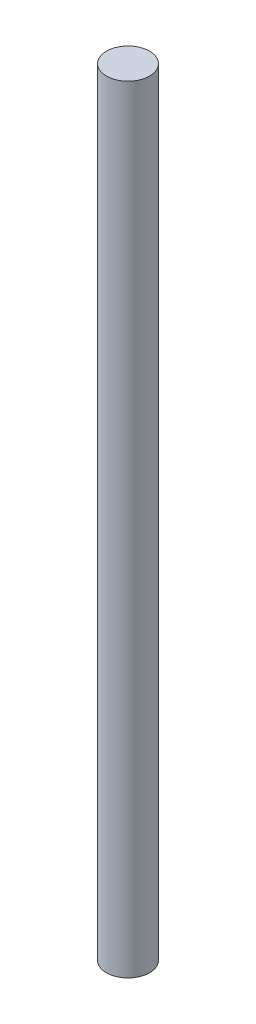
ISO-10303-21;
HEADER;
FILE_DESCRIPTION(('STEP AP214'),'2;1');
FILE_NAME('part.step','',(''),(''),'','','');
FILE_SCHEMA(('AUTOMOTIVE_DESIGN { 1 0 10303 214 1 1 1 1 }'));
ENDSEC;
DATA;
#1=APPLICATION_CONTEXT('core data for automotive mechanical design processes');
#2=APPLICATION_PROTOCOL_DEFINITION('international standard','automotive_design',2000,#1);
#3=PRODUCT_CONTEXT('',#1,'mechanical');
#4=PRODUCT('Part','Part','',(#3));
#5=PRODUCT_RELATED_PRODUCT_CATEGORY('part','',(#4));
#6=PRODUCT_DEFINITION_FORMATION('','',#4);
#7=PRODUCT_DEFINITION_CONTEXT('part definition',#1,'design');
#8=PRODUCT_DEFINITION('design','',#6,#7);
#9=PRODUCT_DEFINITION_SHAPE('','',#8);
#10=(LENGTH_UNIT() NAMED_UNIT(*) SI_UNIT(.MILLI.,.METRE.));
#11=(NAMED_UNIT(*) PLANE_ANGLE_UNIT() SI_UNIT($,.RADIAN.));
#12=(NAMED_UNIT(*) SI_UNIT($,.STERADIAN.) SOLID_ANGLE_UNIT());
#13=UNCERTAINTY_MEASURE_WITH_UNIT(LENGTH_MEASURE(1.E-05),#10,'distance_accuracy_value','');
#14=(GEOMETRIC_REPRESENTATION_CONTEXT(3) GLOBAL_UNCERTAINTY_ASSIGNED_CONTEXT((#13)) GLOBAL_UNIT_ASSIGNED_CONTEXT((#10,
#11,#12)) REPRESENTATION_CONTEXT('',''));
#15=CARTESIAN_POINT('',(0.,0.,0.));
#16=DIRECTION('',(0.,0.,1.));
#17=DIRECTION('',(1.,0.,0.));
#18=AXIS2_PLACEMENT_3D('',#15,#16,#17);
#19=CARTESIAN_POINT('',(0.,90.,0.));
#20=DIRECTION('',(0.,-1.,0.));
#21=DIRECTION('',(0.,0.,-1.));
#22=AXIS2_PLACEMENT_3D('',#19,#20,#21);
#23=CYLINDRICAL_SURFACE('',#22,2.5);
#24=CARTESIAN_POINT('',(0.,90.,0.));
#25=DIRECTION('',(0.,1.,0.));
#26=DIRECTION('',(0.,0.,1.));
#27=AXIS2_PLACEMENT_3D('',#24,#25,#26);
#28=CIRCLE('',#27,2.5);
#29=CARTESIAN_POINT('',(0.,90.,-2.5));
#30=VERTEX_POINT('',#29);
#31=EDGE_CURVE('E10',#30,#30,#28,.T.);
#32=CARTESIAN_POINT('',(0.,0.,0.));
#33=DIRECTION('',(0.,1.,0.));
#34=DIRECTION('',(0.,0.,1.));
#35=AXIS2_PLACEMENT_3D('',#32,#33,#34);
#36=CIRCLE('',#35,2.5);
#37=CARTESIAN_POINT('',(0.,0.,-2.5));
#38=VERTEX_POINT('',#37);
#39=EDGE_CURVE('E36',#38,#38,#36,.T.);
#40=CARTESIAN_POINT('',(0.,90.,-2.5));
#41=CARTESIAN_POINT('',(0.,89.0625,-2.5));
#42=CARTESIAN_POINT('',(0.,88.125,-2.5));
#43=CARTESIAN_POINT('',(0.,86.25,-2.5));
#44=CARTESIAN_POINT('',(0.,85.3125,-2.5));
#45=CARTESIAN_POINT('',(0.,83.4375,-2.5));
#46=CARTESIAN_POINT('',(0.,82.5,-2.5));
#47=CARTESIAN_POINT('',(0.,80.625,-2.5));
#48=CARTESIAN_POINT('',(0.,79.6875,-2.5));
#49=CARTESIAN_POINT('',(0.,77.8125,-2.5));
#50=CARTESIAN_POINT('',(0.,76.875,-2.5));
#51=CARTESIAN_POINT('',(0.,75.,-2.5));
#52=CARTESIAN_POINT('',(0.,74.0625,-2.5));
#53=CARTESIAN_POINT('',(0.,72.1875,-2.5));
#54=CARTESIAN_POINT('',(0.,71.25,-2.5));
#55=CARTESIAN_POINT('',(0.,69.375,-2.5));
#56=CARTESIAN_POINT('',(0.,68.4375,-2.5));
#57=CARTESIAN_POINT('',(0.,66.5625,-2.5));
#58=CARTESIAN_POINT('',(0.,65.625,-2.5));
#59=CARTESIAN_POINT('',(0.,63.75,-2.5));
#60=CARTESIAN_POINT('',(0.,62.8125,-2.5));
#61=CARTESIAN_POINT('',(0.,60.9375,-2.5));
#62=CARTESIAN_POINT('',(0.,60.,-2.5));
#63=CARTESIAN_POINT('',(0.,58.125,-2.5));
#64=CARTESIAN_POINT('',(0.,57.1875,-2.5));
#65=CARTESIAN_POINT('',(0.,55.3125,-2.5));
#66=CARTESIAN_POINT('',(0.,54.375,-2.5));
#67=CARTESIAN_POINT('',(0.,52.5,-2.5));
#68=CARTESIAN_POINT('',(0.,51.5625,-2.5));
#69=CARTESIAN_POINT('',(0.,49.6875,-2.5));
#70=CARTESIAN_POINT('',(0.,48.75,-2.5));
#71=CARTESIAN_POINT('',(0.,46.875,-2.5));
#72=CARTESIAN_POINT('',(0.,45.9375,-2.5));
#73=CARTESIAN_POINT('',(0.,44.0625,-2.5));
#74=CARTESIAN_POINT('',(0.,43.125,-2.5));
#75=CARTESIAN_POINT('',(0.,41.25,-2.5));
#76=CARTESIAN_POINT('',(0.,40.3125,-2.5));
#77=CARTESIAN_POINT('',(0.,38.4375,-2.5));
#78=CARTESIAN_POINT('',(0.,37.5,-2.5));
#79=CARTESIAN_POINT('',(0.,35.625,-2.5));
#80=CARTESIAN_POINT('',(0.,34.6875,-2.5));
#81=CARTESIAN_POINT('',(0.,32.8125,-2.5));
#82=CARTESIAN_POINT('',(0.,31.875,-2.5));
#83=CARTESIAN_POINT('',(0.,30.,-2.5));
#84=CARTESIAN_POINT('',(0.,29.0625,-2.5));
#85=CARTESIAN_POINT('',(0.,27.1875,-2.5));
#86=CARTESIAN_POINT('',(0.,26.25,-2.5));
#87=CARTESIAN_POINT('',(0.,24.375,-2.5));
#88=CARTESIAN_POINT('',(0.,23.4375,-2.5));
#89=CARTESIAN_POINT('',(0.,21.5625,-2.5));
#90=CARTESIAN_POINT('',(0.,20.625,-2.5));
#91=CARTESIAN_POINT('',(0.,18.75,-2.5));
#92=CARTESIAN_POINT('',(0.,17.8125,-2.5));
#93=CARTESIAN_POINT('',(0.,15.9375,-2.5));
#94=CARTESIAN_POINT('',(0.,15.,-2.5));
#95=CARTESIAN_POINT('',(0.,13.125,-2.5));
#96=CARTESIAN_POINT('',(0.,12.1875,-2.5));
#97=CARTESIAN_POINT('',(0.,10.3125,-2.5));
#98=CARTESIAN_POINT('',(0.,9.37499999999999,-2.5));
#99=CARTESIAN_POINT('',(0.,7.49999999999999,-2.5));
#100=CARTESIAN_POINT('',(0.,6.56249999999999,-2.5));
#101=CARTESIAN_POINT('',(0.,4.68749999999999,-2.5));
#102=CARTESIAN_POINT('',(0.,3.74999999999998,-2.5));
#103=CARTESIAN_POINT('',(0.,1.87499999999998,-2.5));
#104=CARTESIAN_POINT('',(0.,0.937499999999986,-2.5));
#105=CARTESIAN_POINT('',(0.,0.,-2.5));
#106=B_SPLINE_CURVE_WITH_KNOTS('',3,(#40,#41,#42,#43,#44,#45,#46,#47,#48,#49,#50,#51,#52,#53,
#54,#55,#56,#57,#58,#59,#60,#61,#62,#63,#64,#65,#66,#67,#68,#69,#70,#71,#72,#73,#74,#75,#76,#77,
#78,#79,#80,#81,#82,#83,#84,#85,#86,#87,#88,#89,#90,#91,#92,#93,#94,#95,#96,#97,#98,#99,#100,
#101,#102,#103,#104,#105),.UNSPECIFIED.,.F.,.F.,(4,2,2,2,2,2,2,2,2,2,2,2,2,2,2,2,2,2,2,2,2,2,2,
2,2,2,2,2,2,2,2,2,4),(0.,2.81250000000001,5.62500000000001,8.43750000000001,11.25,14.0625,
16.875,19.6875,22.5,25.3125,28.125,30.9375,33.75,36.5625,39.375,42.1875,45.,47.8125,50.625,
53.4375,56.25,59.0625,61.875,64.6875,67.5,70.3125,73.125,75.9375,78.75,81.5625,84.375,87.1875,
90.),.UNSPECIFIED.);
#107=EDGE_CURVE('BSEAM33',#30,#38,#106,.T.);
#108=ORIENTED_EDGE('',*,*,#31,.F.);
#109=ORIENTED_EDGE('',*,*,#39,.T.);
#110=ORIENTED_EDGE('',*,*,#107,.T.);
#111=ORIENTED_EDGE('',*,*,#107,.F.);
#112=EDGE_LOOP('',(#108,#110,#109,#111));
#113=FACE_BOUND('',#112,.T.);
#114=ADVANCED_FACE('F33',(#113),#23,.T.);
#115=CARTESIAN_POINT('',(0.,90.,0.));
#116=DIRECTION('',(0.,1.,0.));
#117=DIRECTION('',(0.,0.,1.));
#118=AXIS2_PLACEMENT_3D('',#115,#116,#117);
#119=PLANE('',#118);
#120=ORIENTED_EDGE('',*,*,#31,.T.);
#121=EDGE_LOOP('',(#120));
#122=FACE_BOUND('',#121,.T.);
#123=ADVANCED_FACE('F48',(#122),#119,.T.);
#124=CARTESIAN_POINT('',(0.,0.,0.));
#125=DIRECTION('',(0.,1.,0.));
#126=DIRECTION('',(0.,0.,1.));
#127=AXIS2_PLACEMENT_3D('',#124,#125,#126);
#128=PLANE('',#127);
#129=ORIENTED_EDGE('',*,*,#39,.F.);
#130=EDGE_LOOP('',(#129));
#131=FACE_BOUND('',#130,.T.);
#132=ADVANCED_FACE('F46',(#131),#128,.F.);
#133=CLOSED_SHELL('',(#114,#123,#132));
#134=MANIFOLD_SOLID_BREP('B2',#133);
#135=ADVANCED_BREP_SHAPE_REPRESENTATION('',(#18,#134),#14);
#136=SHAPE_DEFINITION_REPRESENTATION(#9,#135);
ENDSEC;
END-ISO-10303-21;
